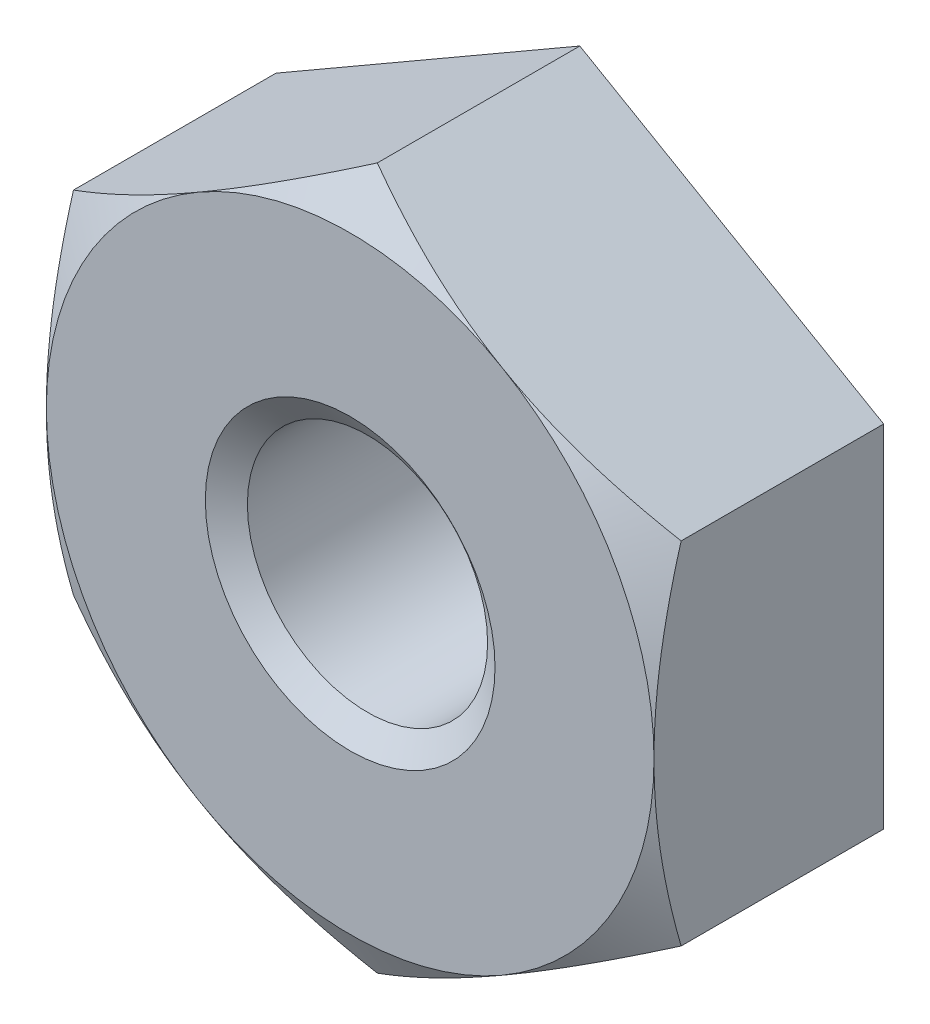
ISO-10303-21;
HEADER;
FILE_DESCRIPTION(('STEP AP214'),'2;1');
FILE_NAME('part.step','',(''),(''),'','','');
FILE_SCHEMA(('AUTOMOTIVE_DESIGN { 1 0 10303 214 1 1 1 1 }'));
ENDSEC;
DATA;
#1=APPLICATION_CONTEXT('core data for automotive mechanical design processes');
#2=APPLICATION_PROTOCOL_DEFINITION('international standard','automotive_design',2000,#1);
#3=PRODUCT_CONTEXT('',#1,'mechanical');
#4=PRODUCT('Part','Part','',(#3));
#5=PRODUCT_RELATED_PRODUCT_CATEGORY('part','',(#4));
#6=PRODUCT_DEFINITION_FORMATION('','',#4);
#7=PRODUCT_DEFINITION_CONTEXT('part definition',#1,'design');
#8=PRODUCT_DEFINITION('design','',#6,#7);
#9=PRODUCT_DEFINITION_SHAPE('','',#8);
#10=(LENGTH_UNIT() NAMED_UNIT(*) SI_UNIT(.MILLI.,.METRE.));
#11=(NAMED_UNIT(*) PLANE_ANGLE_UNIT() SI_UNIT($,.RADIAN.));
#12=(NAMED_UNIT(*) SI_UNIT($,.STERADIAN.) SOLID_ANGLE_UNIT());
#13=UNCERTAINTY_MEASURE_WITH_UNIT(LENGTH_MEASURE(1.E-05),#10,'distance_accuracy_value','');
#14=(GEOMETRIC_REPRESENTATION_CONTEXT(3) GLOBAL_UNCERTAINTY_ASSIGNED_CONTEXT((#13)) GLOBAL_UNIT_ASSIGNED_CONTEXT((#10,
#11,#12)) REPRESENTATION_CONTEXT('',''));
#15=CARTESIAN_POINT('',(0.,0.,0.));
#16=DIRECTION('',(0.,0.,1.));
#17=DIRECTION('',(1.,0.,0.));
#18=AXIS2_PLACEMENT_3D('',#15,#16,#17);
#19=CARTESIAN_POINT('',(0.,0.,-3.302));
#20=DIRECTION('',(0.,0.,1.));
#21=DIRECTION('',(1.,0.,0.));
#22=AXIS2_PLACEMENT_3D('',#19,#20,#21);
#23=CYLINDRICAL_SURFACE('',#22,1.7272);
#24=CARTESIAN_POINT('',(0.,0.,-0.248993800587372));
#25=DIRECTION('',(0.,0.,1.));
#26=DIRECTION('',(1.,0.,0.));
#27=AXIS2_PLACEMENT_3D('',#24,#25,#26);
#28=CIRCLE('',#27,1.7272);
#29=CARTESIAN_POINT('',(1.7272,0.,-0.248993800587372));
#30=VERTEX_POINT('',#29);
#31=EDGE_CURVE('E129',#30,#30,#28,.F.);
#32=CARTESIAN_POINT('',(0.,0.,-3.02760619941263));
#33=DIRECTION('',(0.,0.,-1.));
#34=DIRECTION('',(-1.,0.,0.));
#35=AXIS2_PLACEMENT_3D('',#32,#33,#34);
#36=CIRCLE('',#35,1.7272);
#37=CARTESIAN_POINT('',(1.7272,0.,-3.02760619941263));
#38=VERTEX_POINT('',#37);
#39=EDGE_CURVE('E35',#38,#38,#36,.F.);
#40=CARTESIAN_POINT('',(1.7272,0.,-0.248993800587372));
#41=CARTESIAN_POINT('',(1.7272,0.,-0.277937679741802));
#42=CARTESIAN_POINT('',(1.7272,0.,-0.306881558896231));
#43=CARTESIAN_POINT('',(1.7272,0.,-0.364769317205091));
#44=CARTESIAN_POINT('',(1.7272,0.,-0.39371319635952));
#45=CARTESIAN_POINT('',(1.7272,0.,-0.45160095466838));
#46=CARTESIAN_POINT('',(1.7272,0.,-0.48054483382281));
#47=CARTESIAN_POINT('',(1.7272,0.,-0.538432592131669));
#48=CARTESIAN_POINT('',(1.7272,0.,-0.567376471286099));
#49=CARTESIAN_POINT('',(1.7272,0.,-0.625264229594958));
#50=CARTESIAN_POINT('',(1.7272,0.,-0.654208108749388));
#51=CARTESIAN_POINT('',(1.7272,0.,-0.712095867058248));
#52=CARTESIAN_POINT('',(1.7272,0.,-0.741039746212677));
#53=CARTESIAN_POINT('',(1.7272,0.,-0.798927504521537));
#54=CARTESIAN_POINT('',(1.7272,0.,-0.827871383675967));
#55=CARTESIAN_POINT('',(1.7272,0.,-0.885759141984826));
#56=CARTESIAN_POINT('',(1.7272,0.,-0.914703021139256));
#57=CARTESIAN_POINT('',(1.7272,0.,-0.972590779448115));
#58=CARTESIAN_POINT('',(1.7272,0.,-1.00153465860254));
#59=CARTESIAN_POINT('',(1.7272,0.,-1.0594224169114));
#60=CARTESIAN_POINT('',(1.7272,0.,-1.08836629606583));
#61=CARTESIAN_POINT('',(1.7272,0.,-1.14625405437469));
#62=CARTESIAN_POINT('',(1.7272,0.,-1.17519793352912));
#63=CARTESIAN_POINT('',(1.7272,0.,-1.23308569183798));
#64=CARTESIAN_POINT('',(1.7272,0.,-1.26202957099241));
#65=CARTESIAN_POINT('',(1.7272,0.,-1.31991732930127));
#66=CARTESIAN_POINT('',(1.7272,0.,-1.3488612084557));
#67=CARTESIAN_POINT('',(1.7272,0.,-1.40674896676456));
#68=CARTESIAN_POINT('',(1.7272,0.,-1.43569284591899));
#69=CARTESIAN_POINT('',(1.7272,0.,-1.49358060422785));
#70=CARTESIAN_POINT('',(1.7272,0.,-1.52252448338228));
#71=CARTESIAN_POINT('',(1.7272,0.,-1.58041224169114));
#72=CARTESIAN_POINT('',(1.7272,0.,-1.60935612084557));
#73=CARTESIAN_POINT('',(1.7272,0.,-1.66724387915443));
#74=CARTESIAN_POINT('',(1.7272,0.,-1.69618775830886));
#75=CARTESIAN_POINT('',(1.7272,0.,-1.75407551661772));
#76=CARTESIAN_POINT('',(1.7272,0.,-1.78301939577215));
#77=CARTESIAN_POINT('',(1.7272,0.,-1.84090715408101));
#78=CARTESIAN_POINT('',(1.7272,0.,-1.86985103323544));
#79=CARTESIAN_POINT('',(1.7272,0.,-1.9277387915443));
#80=CARTESIAN_POINT('',(1.7272,0.,-1.95668267069873));
#81=CARTESIAN_POINT('',(1.7272,0.,-2.01457042900758));
#82=CARTESIAN_POINT('',(1.7272,0.,-2.04351430816201));
#83=CARTESIAN_POINT('',(1.7272,0.,-2.10140206647087));
#84=CARTESIAN_POINT('',(1.7272,0.,-2.1303459456253));
#85=CARTESIAN_POINT('',(1.7272,0.,-2.18823370393416));
#86=CARTESIAN_POINT('',(1.7272,0.,-2.21717758308859));
#87=CARTESIAN_POINT('',(1.7272,0.,-2.27506534139745));
#88=CARTESIAN_POINT('',(1.7272,0.,-2.30400922055188));
#89=CARTESIAN_POINT('',(1.7272,0.,-2.36189697886074));
#90=CARTESIAN_POINT('',(1.7272,0.,-2.39084085801517));
#91=CARTESIAN_POINT('',(1.7272,0.,-2.44872861632403));
#92=CARTESIAN_POINT('',(1.7272,0.,-2.47767249547846));
#93=CARTESIAN_POINT('',(1.7272,0.,-2.53556025378732));
#94=CARTESIAN_POINT('',(1.7272,0.,-2.56450413294175));
#95=CARTESIAN_POINT('',(1.7272,0.,-2.62239189125061));
#96=CARTESIAN_POINT('',(1.7272,0.,-2.65133577040504));
#97=CARTESIAN_POINT('',(1.7272,0.,-2.7092235287139));
#98=CARTESIAN_POINT('',(1.7272,0.,-2.73816740786833));
#99=CARTESIAN_POINT('',(1.7272,0.,-2.79605516617719));
#100=CARTESIAN_POINT('',(1.7272,0.,-2.82499904533162));
#101=CARTESIAN_POINT('',(1.7272,0.,-2.88288680364048));
#102=CARTESIAN_POINT('',(1.7272,0.,-2.91183068279491));
#103=CARTESIAN_POINT('',(1.7272,0.,-2.96971844110377));
#104=CARTESIAN_POINT('',(1.7272,0.,-2.9986623202582));
#105=CARTESIAN_POINT('',(1.7272,0.,-3.02760619941263));
#106=B_SPLINE_CURVE_WITH_KNOTS('',3,(#40,#41,#42,#43,#44,#45,#46,#47,#48,#49,#50,#51,#52,#53,
#54,#55,#56,#57,#58,#59,#60,#61,#62,#63,#64,#65,#66,#67,#68,#69,#70,#71,#72,#73,#74,#75,#76,#77,
#78,#79,#80,#81,#82,#83,#84,#85,#86,#87,#88,#89,#90,#91,#92,#93,#94,#95,#96,#97,#98,#99,#100,
#101,#102,#103,#104,#105),.UNSPECIFIED.,.F.,.F.,(4,2,2,2,2,2,2,2,2,2,2,2,2,2,2,2,2,2,2,2,2,2,2,
2,2,2,2,2,2,2,2,2,4),(0.,0.0868316374632891,0.173663274926578,0.260494912389868,
0.347326549853157,0.434158187316446,0.520989824779735,0.607821462243024,0.694653099706314,
0.781484737169603,0.868316374632892,0.955148012096181,1.04197964955947,1.12881128702276,
1.21564292448605,1.30247456194934,1.38930619941263,1.47613783687592,1.56296947433921,
1.64980111180249,1.73663274926578,1.82346438672907,1.91029602419236,1.99712766165565,
2.08395929911894,2.17079093658223,2.25762257404552,2.34445421150881,2.4312858489721,
2.51811748643539,2.60494912389868,2.69178076136196,2.77861239882525),.UNSPECIFIED.);
#107=EDGE_CURVE('BSEAM30',#30,#38,#106,.T.);
#108=ORIENTED_EDGE('',*,*,#31,.F.);
#109=ORIENTED_EDGE('',*,*,#39,.F.);
#110=ORIENTED_EDGE('',*,*,#107,.T.);
#111=ORIENTED_EDGE('',*,*,#107,.F.);
#112=EDGE_LOOP('',(#108,#110,#109,#111));
#113=FACE_BOUND('',#112,.T.);
#114=ADVANCED_FACE('F30',(#113),#23,.F.);
#115=CARTESIAN_POINT('',(-8.73759999999999,0.,-3.302));
#116=DIRECTION('',(0.,0.,1.));
#117=DIRECTION('',(1.,0.,0.));
#118=AXIS2_PLACEMENT_3D('',#115,#116,#117);
#119=PLANE('',#118);
#120=DIRECTION('',(-0.866025403784438,-0.500000000000001,0.));
#121=VECTOR('',#120,1.);
#122=CARTESIAN_POINT('',(0.,5.04465571207128,-3.302));
#123=LINE('',#122,#121);
#124=CARTESIAN_POINT('',(0.,5.04465571207128,-3.302));
#125=VERTEX_POINT('',#124);
#126=CARTESIAN_POINT('',(-4.3688,2.52232785603563,-3.302));
#127=VERTEX_POINT('',#126);
#128=EDGE_CURVE('E252',#125,#127,#123,.T.);
#129=ORIENTED_EDGE('',*,*,#128,.F.);
#130=DIRECTION('',(-0.866025403784438,0.500000000000001,0.));
#131=VECTOR('',#130,1.);
#132=CARTESIAN_POINT('',(4.3688,2.52232785603564,-3.302));
#133=LINE('',#132,#131);
#134=CARTESIAN_POINT('',(4.3688,2.52232785603564,-3.302));
#135=VERTEX_POINT('',#134);
#136=EDGE_CURVE('E228',#135,#125,#133,.T.);
#137=ORIENTED_EDGE('',*,*,#136,.F.);
#138=DIRECTION('',(0.,-1.,0.));
#139=VECTOR('',#138,1.);
#140=CARTESIAN_POINT('',(4.3688,2.52232785603564,-3.302));
#141=LINE('',#140,#139);
#142=CARTESIAN_POINT('',(4.3688,-2.52232785603564,-3.302));
#143=VERTEX_POINT('',#142);
#144=EDGE_CURVE('E241',#135,#143,#141,.T.);
#145=ORIENTED_EDGE('',*,*,#144,.T.);
#146=DIRECTION('',(0.866025403784438,0.500000000000001,0.));
#147=VECTOR('',#146,1.);
#148=CARTESIAN_POINT('',(0.,-5.04465571207129,-3.302));
#149=LINE('',#148,#147);
#150=CARTESIAN_POINT('',(0.,-5.04465571207129,-3.302));
#151=VERTEX_POINT('',#150);
#152=EDGE_CURVE('E243',#151,#143,#149,.T.);
#153=ORIENTED_EDGE('',*,*,#152,.F.);
#154=DIRECTION('',(0.866025403784438,-0.500000000000001,0.));
#155=VECTOR('',#154,1.);
#156=CARTESIAN_POINT('',(-4.3688,-2.52232785603564,-3.302));
#157=LINE('',#156,#155);
#158=CARTESIAN_POINT('',(-4.3688,-2.52232785603564,-3.302));
#159=VERTEX_POINT('',#158);
#160=EDGE_CURVE('E246',#159,#151,#157,.T.);
#161=ORIENTED_EDGE('',*,*,#160,.F.);
#162=DIRECTION('',(0.,-1.,0.));
#163=VECTOR('',#162,1.);
#164=CARTESIAN_POINT('',(-4.3688,2.52232785603563,-3.302));
#165=LINE('',#164,#163);
#166=EDGE_CURVE('E249',#127,#159,#165,.T.);
#167=ORIENTED_EDGE('',*,*,#166,.F.);
#168=EDGE_LOOP('',(#129,#137,#145,#153,#161,#167));
#169=FACE_BOUND('',#168,.T.);
#170=CARTESIAN_POINT('',(0.,0.,-3.302));
#171=DIRECTION('',(0.,0.,1.));
#172=DIRECTION('',(1.,0.,0.));
#173=AXIS2_PLACEMENT_3D('',#170,#171,#172);
#174=CIRCLE('',#173,2.0828);
#175=CARTESIAN_POINT('',(2.0828,0.,-3.302));
#176=VERTEX_POINT('',#175);
#177=EDGE_CURVE('E213',#176,#176,#174,.F.);
#178=ORIENTED_EDGE('',*,*,#177,.F.);
#179=EDGE_LOOP('',(#178));
#180=FACE_BOUND('',#179,.T.);
#181=ADVANCED_FACE('F200',(#169,#180),#119,.F.);
#182=CARTESIAN_POINT('',(-8.73759999999999,0.,0.));
#183=DIRECTION('',(0.,0.,1.));
#184=DIRECTION('',(1.,0.,0.));
#185=AXIS2_PLACEMENT_3D('',#182,#183,#184);
#186=PLANE('',#185);
#187=CARTESIAN_POINT('',(0.,0.,0.));
#188=DIRECTION('',(0.,0.,1.));
#189=DIRECTION('',(1.,0.,0.));
#190=AXIS2_PLACEMENT_3D('',#187,#188,#189);
#191=CIRCLE('',#190,4.3688);
#192=CARTESIAN_POINT('',(4.3688,0.,0.));
#193=VERTEX_POINT('',#192);
#194=CARTESIAN_POINT('',(2.18440000000001,-3.78349178405345,0.));
#195=VERTEX_POINT('',#194);
#196=EDGE_CURVE('E11',#193,#195,#191,.F.);
#197=ORIENTED_EDGE('',*,*,#196,.F.);
#198=CARTESIAN_POINT('',(0.,0.,0.));
#199=DIRECTION('',(0.,0.,1.));
#200=DIRECTION('',(1.,0.,0.));
#201=AXIS2_PLACEMENT_3D('',#198,#199,#200);
#202=CIRCLE('',#201,4.3688);
#203=CARTESIAN_POINT('',(2.1844,3.78349178405345,0.));
#204=VERTEX_POINT('',#203);
#205=EDGE_CURVE('E121',#193,#204,#202,.T.);
#206=ORIENTED_EDGE('',*,*,#205,.T.);
#207=CARTESIAN_POINT('',(-2.18440000000001,3.78349178405345,0.));
#208=VERTEX_POINT('',#207);
#209=EDGE_CURVE('E42',#208,#204,#191,.F.);
#210=ORIENTED_EDGE('',*,*,#209,.F.);
#211=CARTESIAN_POINT('',(-4.3688,0.,0.));
#212=VERTEX_POINT('',#211);
#213=EDGE_CURVE('E281',#212,#208,#191,.F.);
#214=ORIENTED_EDGE('',*,*,#213,.F.);
#215=CARTESIAN_POINT('',(-2.1844,-3.78349178405345,0.));
#216=VERTEX_POINT('',#215);
#217=EDGE_CURVE('E279',#216,#212,#191,.F.);
#218=ORIENTED_EDGE('',*,*,#217,.F.);
#219=EDGE_CURVE('E40',#195,#216,#191,.F.);
#220=ORIENTED_EDGE('',*,*,#219,.F.);
#221=EDGE_LOOP('',(#197,#206,#210,#214,#218,#220));
#222=FACE_BOUND('',#221,.T.);
#223=CARTESIAN_POINT('',(0.,0.,0.));
#224=DIRECTION('',(0.,0.,1.));
#225=DIRECTION('',(1.,0.,0.));
#226=AXIS2_PLACEMENT_3D('',#223,#224,#225);
#227=CIRCLE('',#226,2.0828);
#228=CARTESIAN_POINT('',(2.0828,0.,0.));
#229=VERTEX_POINT('',#228);
#230=EDGE_CURVE('E212',#229,#229,#227,.T.);
#231=ORIENTED_EDGE('',*,*,#230,.F.);
#232=EDGE_LOOP('',(#231));
#233=FACE_BOUND('',#232,.T.);
#234=ADVANCED_FACE('F131',(#222,#233),#186,.T.);
#235=CARTESIAN_POINT('',(0.,5.04465571207128,-3.302));
#236=DIRECTION('',(-0.500000000000001,0.866025403784438,0.));
#237=DIRECTION('',(-0.866025403784438,-0.500000000000001,0.));
#238=AXIS2_PLACEMENT_3D('',#235,#236,#237);
#239=PLANE('',#238);
#240=DIRECTION('',(0.,0.,1.));
#241=VECTOR('',#240,1.);
#242=CARTESIAN_POINT('',(-4.3688,2.52232785603563,-3.302));
#243=LINE('',#242,#241);
#244=CARTESIAN_POINT('',(-4.3688,2.52232785603563,-0.3902054772977));
#245=VERTEX_POINT('',#244);
#246=EDGE_CURVE('E224',#127,#245,#243,.T.);
#247=ORIENTED_EDGE('',*,*,#246,.T.);
#248=CARTESIAN_POINT('',(-4.369,2.52221238598179,-0.390272146253268));
#249=CARTESIAN_POINT('',(-4.17701432322195,2.63305536815015,-0.326254019345325));
#250=CARTESIAN_POINT('',(-3.98337143625713,2.74485514106595,-0.268032047091907));
#251=CARTESIAN_POINT('',(-3.59273259013828,2.97039058402859,-0.166405423750635));
#252=CARTESIAN_POINT('',(-3.39572969030934,3.08413026127597,-0.123036723706271));
#253=CARTESIAN_POINT('',(-3.00416535018124,3.31020003845398,-0.0555275892763381));
#254=CARTESIAN_POINT('',(-2.8096641539418,3.42249535646053,-0.0309378363235533));
#255=CARTESIAN_POINT('',(-2.41974664983152,3.64761433242035,-0.00158375292557013));
#256=CARTESIAN_POINT('',(-2.22433175903685,3.76043717222432,0.00320488626191379));
#257=CARTESIAN_POINT('',(-1.85919363799043,3.97124976470186,-0.00676154410745537));
#258=CARTESIAN_POINT('',(-1.6894157250961,4.06927108841386,-0.0190695182980131));
#259=CARTESIAN_POINT('',(-1.35096599187974,4.26467513299348,-0.0580772044287665));
#260=CARTESIAN_POINT('',(-1.18229534203414,4.36205717808622,-0.0847902391814816));
#261=CARTESIAN_POINT('',(-0.843147890127902,4.55786405073927,-0.151570221556089));
#262=CARTESIAN_POINT('',(-0.67271400871229,4.6562640980536,-0.191920224220218));
#263=CARTESIAN_POINT('',(-0.334388108152011,4.8515966478159,-0.283498656513236));
#264=CARTESIAN_POINT('',(-0.166491755144837,4.94853165242055,-0.33470557081654));
#265=CARTESIAN_POINT('',(0.000199999999998779,5.04477118212511,-0.390272146253271));
#266=B_SPLINE_CURVE_WITH_KNOTS('',3,(#248,#249,#250,#251,#252,#253,#254,#255,#256,#257,#258,
#259,#260,#261,#262,#263,#264,#265),.UNSPECIFIED.,.F.,.F.,(4,2,2,2,2,2,2,2,4),(0.,
0.692505588180071,1.38667567200999,2.06366565456448,2.73982428641929,3.32854996891366,
3.91782108250885,4.5201625585125,5.12132133857944),.UNSPECIFIED.);
#267=EDGE_CURVE('E115',#245,#208,#266,.T.);
#268=ORIENTED_EDGE('',*,*,#267,.T.);
#269=CARTESIAN_POINT('',(0.,5.04465571207128,-0.390205477297699));
#270=VERTEX_POINT('',#269);
#271=EDGE_CURVE('E142',#208,#270,#266,.T.);
#272=ORIENTED_EDGE('',*,*,#271,.T.);
#273=DIRECTION('',(0.,0.,1.));
#274=VECTOR('',#273,1.);
#275=CARTESIAN_POINT('',(0.,5.04465571207128,-3.302));
#276=LINE('',#275,#274);
#277=EDGE_CURVE('E236',#125,#270,#276,.T.);
#278=ORIENTED_EDGE('',*,*,#277,.F.);
#279=ORIENTED_EDGE('',*,*,#128,.T.);
#280=EDGE_LOOP('',(#247,#268,#272,#278,#279));
#281=FACE_BOUND('',#280,.T.);
#282=ADVANCED_FACE('F32',(#281),#239,.T.);
#283=CARTESIAN_POINT('',(4.3688,2.52232785603564,-3.302));
#284=DIRECTION('',(0.5,0.866025403784438,0.));
#285=DIRECTION('',(-0.866025403784438,0.500000000000001,0.));
#286=AXIS2_PLACEMENT_3D('',#283,#284,#285);
#287=PLANE('',#286);
#288=ORIENTED_EDGE('',*,*,#277,.T.);
#289=CARTESIAN_POINT('',(-0.000200000000001958,5.04477118212511,-0.390272146253271));
#290=CARTESIAN_POINT('',(0.191785676778043,4.93392819995676,-0.326254019345328));
#291=CARTESIAN_POINT('',(0.385428563742871,4.82212842704096,-0.268032047091909));
#292=CARTESIAN_POINT('',(0.776067409861722,4.59659298407831,-0.166405423750637));
#293=CARTESIAN_POINT('',(0.973070309690658,4.48285330683094,-0.123036723706273));
#294=CARTESIAN_POINT('',(1.36463464981876,4.25678352965292,-0.055527589276339));
#295=CARTESIAN_POINT('',(1.55913584605819,4.14448821164638,-0.0309378363235539));
#296=CARTESIAN_POINT('',(1.94905335016848,3.91936923568656,-0.00158375292557032));
#297=CARTESIAN_POINT('',(2.14446824096316,3.80654639588259,0.00320488626191369));
#298=CARTESIAN_POINT('',(2.50960636200957,3.59573380340505,-0.00676154410745529));
#299=CARTESIAN_POINT('',(2.67938427490391,3.49771247969305,-0.019069518298013));
#300=CARTESIAN_POINT('',(3.01783400812026,3.30230843511343,-0.058077204428766));
#301=CARTESIAN_POINT('',(3.18650465796586,3.20492639002069,-0.0847902391814807));
#302=CARTESIAN_POINT('',(3.5256521098721,3.00911951736764,-0.151570221556088));
#303=CARTESIAN_POINT('',(3.69608599128771,2.91071947005331,-0.191920224220216));
#304=CARTESIAN_POINT('',(4.03441189184799,2.71538692029101,-0.283498656513234));
#305=CARTESIAN_POINT('',(4.20230824485516,2.61845191568636,-0.334705570816538));
#306=CARTESIAN_POINT('',(4.369,2.5222123859818,-0.390272146253269));
#307=B_SPLINE_CURVE_WITH_KNOTS('',3,(#289,#290,#291,#292,#293,#294,#295,#296,#297,#298,#299,
#300,#301,#302,#303,#304,#305,#306),.UNSPECIFIED.,.F.,.F.,(4,2,2,2,2,2,2,2,4),(0.,
0.692505588180072,1.38667567200999,2.06366565456448,2.73982428641929,3.32854996891367,
3.91782108250886,4.5201625585125,5.12132133857944),.UNSPECIFIED.);
#308=EDGE_CURVE('E138',#270,#204,#307,.T.);
#309=ORIENTED_EDGE('',*,*,#308,.T.);
#310=CARTESIAN_POINT('',(4.3688,2.52232785603564,-0.390205477297699));
#311=VERTEX_POINT('',#310);
#312=EDGE_CURVE('E124',#204,#311,#307,.T.);
#313=ORIENTED_EDGE('',*,*,#312,.T.);
#314=DIRECTION('',(0.,0.,1.));
#315=VECTOR('',#314,1.);
#316=CARTESIAN_POINT('',(4.3688,2.52232785603564,-3.302));
#317=LINE('',#316,#315);
#318=EDGE_CURVE('E137',#135,#311,#317,.T.);
#319=ORIENTED_EDGE('',*,*,#318,.F.);
#320=ORIENTED_EDGE('',*,*,#136,.T.);
#321=EDGE_LOOP('',(#288,#309,#313,#319,#320));
#322=FACE_BOUND('',#321,.T.);
#323=ADVANCED_FACE('F257',(#322),#287,.T.);
#324=CARTESIAN_POINT('',(4.3688,2.52232785603564,-3.302));
#325=DIRECTION('',(-1.,0.,0.));
#326=DIRECTION('',(0.,0.,1.));
#327=AXIS2_PLACEMENT_3D('',#324,#325,#326);
#328=PLANE('',#327);
#329=CARTESIAN_POINT('',(4.3688,-6.68958518743313,-2.09058747015903));
#330=CARTESIAN_POINT('',(4.3688,-6.49777016317985,-1.99789185471359));
#331=CARTESIAN_POINT('',(4.3688,-6.30550162360646,-1.90611771072942));
#332=CARTESIAN_POINT('',(4.3688,-5.919812301523,-1.7249389254409));
#333=CARTESIAN_POINT('',(4.3688,-5.72639132652265,-1.63553469438958));
#334=CARTESIAN_POINT('',(4.3688,-5.33710707680669,-1.45915130833322));
#335=CARTESIAN_POINT('',(4.3688,-5.14123615996685,-1.37218895887827));
#336=CARTESIAN_POINT('',(4.3688,-4.74788442913253,-1.20199950616559));
#337=CARTESIAN_POINT('',(4.3688,-4.55040369969016,-1.11877220820663));
#338=CARTESIAN_POINT('',(4.3688,-4.15106673826398,-0.956057977466858));
#339=CARTESIAN_POINT('',(4.3688,-3.94918655341588,-0.876629508962582));
#340=CARTESIAN_POINT('',(4.3688,-3.54304484348439,-0.723993430313052));
#341=CARTESIAN_POINT('',(4.3688,-3.338783056327,-0.65078651228273));
#342=CARTESIAN_POINT('',(4.3688,-2.92797339248016,-0.512560407179517));
#343=CARTESIAN_POINT('',(4.3688,-2.72143143217471,-0.447523813031698));
#344=CARTESIAN_POINT('',(4.3688,-2.30540922017469,-0.327751192809323));
#345=CARTESIAN_POINT('',(4.3688,-2.09592992027346,-0.27301190932798));
#346=CARTESIAN_POINT('',(4.3688,-1.67389951675793,-0.176488903460131));
#347=CARTESIAN_POINT('',(4.3688,-1.46134761097217,-0.13470863065931));
#348=CARTESIAN_POINT('',(4.3688,-1.03365293078833,-0.0669258210586632));
#349=CARTESIAN_POINT('',(4.3688,-0.818510154099769,-0.0409232982083516));
#350=CARTESIAN_POINT('',(4.3688,-0.495449298048832,-0.0154234920898188));
#351=CARTESIAN_POINT('',(4.3688,-0.38803908099844,-0.00917291776942587));
#352=CARTESIAN_POINT('',(4.3688,-0.173053157711787,-0.00121763636852822));
#353=CARTESIAN_POINT('',(4.3688,-0.0654774536427616,0.000487129745749073));
#354=CARTESIAN_POINT('',(4.3688,0.257152191545762,-0.00132501851328305));
#355=CARTESIAN_POINT('',(4.3688,0.472211053929907,-0.0117601656507523));
#356=CARTESIAN_POINT('',(4.3688,0.839428709857252,-0.0446463142807151));
#357=CARTESIAN_POINT('',(4.3688,0.992000760315655,-0.062811656846004));
#358=CARTESIAN_POINT('',(4.3688,1.29596699062512,-0.10726976718274));
#359=CARTESIAN_POINT('',(4.3688,1.44736101064885,-0.133563618724753));
#360=CARTESIAN_POINT('',(4.3688,1.89965396000277,-0.223261837826227));
#361=CARTESIAN_POINT('',(4.3688,2.19843156204362,-0.297459397479416));
#362=CARTESIAN_POINT('',(4.3688,2.64550767125623,-0.425429796477862));
#363=CARTESIAN_POINT('',(4.3688,2.79613613241495,-0.471517975005144));
#364=CARTESIAN_POINT('',(4.3688,3.09582081741505,-0.568254810771603));
#365=CARTESIAN_POINT('',(4.3688,3.24487804754844,-0.618900322497454));
#366=CARTESIAN_POINT('',(4.3688,3.54079706259956,-0.723697946842163));
#367=CARTESIAN_POINT('',(4.3688,3.68766648253473,-0.777828717406924));
#368=CARTESIAN_POINT('',(4.3688,3.98026581207414,-0.889267440910809));
#369=CARTESIAN_POINT('',(4.3688,4.12599523358397,-0.946576677958952));
#370=CARTESIAN_POINT('',(4.3688,4.27119772033257,-1.00516149694495));
#371=B_SPLINE_CURVE_WITH_KNOTS('',3,(#329,#330,#331,#332,#333,#334,#335,#336,#337,#338,#339,
#340,#341,#342,#343,#344,#345,#346,#347,#348,#349,#350,#351,#352,#353,#354,#355,#356,#357,#358,
#359,#360,#361,#362,#363,#364,#365,#366,#367,#368,#369,#370),.UNSPECIFIED.,.F.,.F.,(4,2,2,2,2,2,
2,2,2,2,2,2,2,2,2,2,2,2,2,2,4),(0.,0.639124631803745,1.27835918866052,1.9212518267235,
2.56411091297887,3.21486231369451,3.86568601259514,4.51509871222719,5.16430563271765,
5.813685218915,6.4630653792447,6.78575484429632,7.10844011874675,7.75350352855424,
8.21423767153292,8.67503327050771,9.59732151021674,10.0698486304712,10.5420520737689,
11.0115976388432,11.4813343033428),.UNSPECIFIED.);
#372=CARTESIAN_POINT('',(4.3688,-2.52232785603564,-0.390205477297699));
#373=VERTEX_POINT('',#372);
#374=EDGE_CURVE('E104',#373,#193,#371,.T.);
#375=ORIENTED_EDGE('',*,*,#374,.F.);
#376=DIRECTION('',(0.,0.,1.));
#377=VECTOR('',#376,1.);
#378=CARTESIAN_POINT('',(4.3688,-2.52232785603564,-3.302));
#379=LINE('',#378,#377);
#380=EDGE_CURVE('E233',#143,#373,#379,.T.);
#381=ORIENTED_EDGE('',*,*,#380,.F.);
#382=ORIENTED_EDGE('',*,*,#144,.F.);
#383=ORIENTED_EDGE('',*,*,#318,.T.);
#384=EDGE_CURVE('E117',#193,#311,#371,.T.);
#385=ORIENTED_EDGE('',*,*,#384,.F.);
#386=EDGE_LOOP('',(#375,#381,#382,#383,#385));
#387=FACE_BOUND('',#386,.T.);
#388=ADVANCED_FACE('F135',(#387),#328,.F.);
#389=CARTESIAN_POINT('',(0.,-5.04465571207129,-3.302));
#390=DIRECTION('',(0.500000000000001,-0.866025403784438,0.));
#391=DIRECTION('',(0.866025403784438,0.500000000000001,0.));
#392=AXIS2_PLACEMENT_3D('',#389,#390,#391);
#393=PLANE('',#392);
#394=ORIENTED_EDGE('',*,*,#380,.T.);
#395=CARTESIAN_POINT('',(4.369,-2.5222123859818,-0.390272146253271));
#396=CARTESIAN_POINT('',(4.17701432322195,-2.63305536815016,-0.326254019345329));
#397=CARTESIAN_POINT('',(3.98337143625713,-2.74485514106596,-0.26803204709191));
#398=CARTESIAN_POINT('',(3.59273259013828,-2.97039058402861,-0.166405423750638));
#399=CARTESIAN_POINT('',(3.39572969030934,-3.08413026127598,-0.123036723706274));
#400=CARTESIAN_POINT('',(3.00416535018124,-3.310200038454,-0.0555275892763415));
#401=CARTESIAN_POINT('',(2.8096641539418,-3.42249535646054,-0.0309378363235572));
#402=CARTESIAN_POINT('',(2.41974664983151,-3.64761433242036,-0.00158375292557479));
#403=CARTESIAN_POINT('',(2.22433175903684,-3.76043717222433,0.0032048862619088));
#404=CARTESIAN_POINT('',(1.85919363799043,-3.97124976470187,-0.00676154410746063));
#405=CARTESIAN_POINT('',(1.68941572509609,-4.06927108841387,-0.0190695182980184));
#406=CARTESIAN_POINT('',(1.35096599187974,-4.26467513299349,-0.0580772044287723));
#407=CARTESIAN_POINT('',(1.18229534203414,-4.36205717808624,-0.0847902391814878));
#408=CARTESIAN_POINT('',(0.8431478901279,-4.55786405073928,-0.151570221556096));
#409=CARTESIAN_POINT('',(0.672714008712288,-4.65626409805362,-0.191920224220224));
#410=CARTESIAN_POINT('',(0.334388108152009,-4.85159664781592,-0.283498656513241));
#411=CARTESIAN_POINT('',(0.166491755144836,-4.94853165242056,-0.334705570816546));
#412=CARTESIAN_POINT('',(-0.000199999999999165,-5.04477118212513,-0.390272146253277));
#413=B_SPLINE_CURVE_WITH_KNOTS('',3,(#395,#396,#397,#398,#399,#400,#401,#402,#403,#404,#405,
#406,#407,#408,#409,#410,#411,#412),.UNSPECIFIED.,.F.,.F.,(4,2,2,2,2,2,2,2,4),(0.,
0.692505588180072,1.38667567200999,2.06366565456448,2.73982428641929,3.32854996891367,
3.91782108250885,4.5201625585125,5.12132133857944),.UNSPECIFIED.);
#414=EDGE_CURVE('E110',#373,#195,#413,.T.);
#415=ORIENTED_EDGE('',*,*,#414,.T.);
#416=CARTESIAN_POINT('',(0.,-5.04465571207128,-0.390205477297699));
#417=VERTEX_POINT('',#416);
#418=EDGE_CURVE('E49',#195,#417,#413,.T.);
#419=ORIENTED_EDGE('',*,*,#418,.T.);
#420=DIRECTION('',(0.,0.,1.));
#421=VECTOR('',#420,1.);
#422=CARTESIAN_POINT('',(0.,-5.04465571207129,-3.302));
#423=LINE('',#422,#421);
#424=EDGE_CURVE('E230',#151,#417,#423,.T.);
#425=ORIENTED_EDGE('',*,*,#424,.F.);
#426=ORIENTED_EDGE('',*,*,#152,.T.);
#427=EDGE_LOOP('',(#394,#415,#419,#425,#426));
#428=FACE_BOUND('',#427,.T.);
#429=ADVANCED_FACE('F189',(#428),#393,.T.);
#430=CARTESIAN_POINT('',(-4.3688,-2.52232785603564,-3.302));
#431=DIRECTION('',(-0.500000000000001,-0.866025403784438,0.));
#432=DIRECTION('',(0.866025403784438,-0.500000000000001,0.));
#433=AXIS2_PLACEMENT_3D('',#430,#431,#432);
#434=PLANE('',#433);
#435=ORIENTED_EDGE('',*,*,#424,.T.);
#436=CARTESIAN_POINT('',(0.000200000000000651,-5.04477118212513,-0.390272146253277));
#437=CARTESIAN_POINT('',(-0.191785676778045,-4.93392819995677,-0.326254019345334));
#438=CARTESIAN_POINT('',(-0.385428563742873,-4.82212842704097,-0.268032047091915));
#439=CARTESIAN_POINT('',(-0.776067409861725,-4.59659298407832,-0.166405423750643));
#440=CARTESIAN_POINT('',(-0.973070309690662,-4.48285330683095,-0.123036723706279));
#441=CARTESIAN_POINT('',(-1.36463464981876,-4.25678352965293,-0.0555275892763448));
#442=CARTESIAN_POINT('',(-1.5591358460582,-4.14448821164639,-0.0309378363235597));
#443=CARTESIAN_POINT('',(-1.94905335016849,-3.91936923568657,-0.00158375292557577));
#444=CARTESIAN_POINT('',(-2.14446824096316,-3.8065463958826,0.00320488626190853));
#445=CARTESIAN_POINT('',(-2.50960636200958,-3.59573380340506,-0.00676154410746014));
#446=CARTESIAN_POINT('',(-2.67938427490391,-3.49771247969306,-0.0190695182980177));
#447=CARTESIAN_POINT('',(-3.01783400812027,-3.30230843511344,-0.0580772044287706));
#448=CARTESIAN_POINT('',(-3.18650465796587,-3.20492639002069,-0.0847902391814854));
#449=CARTESIAN_POINT('',(-3.5256521098721,-3.00911951736765,-0.151570221556092));
#450=CARTESIAN_POINT('',(-3.69608599128771,-2.91071947005332,-0.19192022422022));
#451=CARTESIAN_POINT('',(-4.03441189184799,-2.71538692029102,-0.283498656513237));
#452=CARTESIAN_POINT('',(-4.20230824485516,-2.61845191568637,-0.334705570816541));
#453=CARTESIAN_POINT('',(-4.369,-2.52221238598181,-0.390272146253272));
#454=B_SPLINE_CURVE_WITH_KNOTS('',3,(#436,#437,#438,#439,#440,#441,#442,#443,#444,#445,#446,
#447,#448,#449,#450,#451,#452,#453),.UNSPECIFIED.,.F.,.F.,(4,2,2,2,2,2,2,2,4),(0.,
0.692505588180074,1.38667567200999,2.06366565456448,2.73982428641929,3.32854996891367,
3.91782108250886,4.5201625585125,5.12132133857944),.UNSPECIFIED.);
#455=EDGE_CURVE('E183',#417,#216,#454,.T.);
#456=ORIENTED_EDGE('',*,*,#455,.T.);
#457=CARTESIAN_POINT('',(-4.3688,-2.52232785603564,-0.390205477297699));
#458=VERTEX_POINT('',#457);
#459=EDGE_CURVE('E56',#216,#458,#454,.T.);
#460=ORIENTED_EDGE('',*,*,#459,.T.);
#461=DIRECTION('',(0.,0.,1.));
#462=VECTOR('',#461,1.);
#463=CARTESIAN_POINT('',(-4.3688,-2.52232785603564,-3.302));
#464=LINE('',#463,#462);
#465=EDGE_CURVE('E227',#159,#458,#464,.T.);
#466=ORIENTED_EDGE('',*,*,#465,.F.);
#467=ORIENTED_EDGE('',*,*,#160,.T.);
#468=EDGE_LOOP('',(#435,#456,#460,#466,#467));
#469=FACE_BOUND('',#468,.T.);
#470=ADVANCED_FACE('F185',(#469),#434,.T.);
#471=CARTESIAN_POINT('',(-4.3688,2.52232785603563,-3.302));
#472=DIRECTION('',(-1.,0.,0.));
#473=DIRECTION('',(0.,0.,1.));
#474=AXIS2_PLACEMENT_3D('',#471,#472,#473);
#475=PLANE('',#474);
#476=ORIENTED_EDGE('',*,*,#465,.T.);
#477=CARTESIAN_POINT('',(-4.3688,-6.68958518743314,-2.09058747015903));
#478=CARTESIAN_POINT('',(-4.3688,-6.49777016317985,-1.99789185471359));
#479=CARTESIAN_POINT('',(-4.3688,-6.30550162360647,-1.90611771072943));
#480=CARTESIAN_POINT('',(-4.3688,-5.919812301523,-1.7249389254409));
#481=CARTESIAN_POINT('',(-4.3688,-5.72639132652265,-1.63553469438959));
#482=CARTESIAN_POINT('',(-4.3688,-5.33710707680669,-1.45915130833322));
#483=CARTESIAN_POINT('',(-4.3688,-5.14123615996685,-1.37218895887827));
#484=CARTESIAN_POINT('',(-4.3688,-4.74788442913253,-1.20199950616559));
#485=CARTESIAN_POINT('',(-4.3688,-4.55040369969016,-1.11877220820663));
#486=CARTESIAN_POINT('',(-4.3688,-4.15106673826398,-0.956057977466859));
#487=CARTESIAN_POINT('',(-4.3688,-3.94918655341589,-0.876629508962583));
#488=CARTESIAN_POINT('',(-4.3688,-3.54304484348439,-0.723993430313053));
#489=CARTESIAN_POINT('',(-4.3688,-3.338783056327,-0.650786512282731));
#490=CARTESIAN_POINT('',(-4.3688,-2.92797339248016,-0.512560407179518));
#491=CARTESIAN_POINT('',(-4.3688,-2.72143143217471,-0.447523813031699));
#492=CARTESIAN_POINT('',(-4.3688,-2.3054092201747,-0.327751192809324));
#493=CARTESIAN_POINT('',(-4.3688,-2.09592992027346,-0.273011909327981));
#494=CARTESIAN_POINT('',(-4.3688,-1.67389951675794,-0.176488903460131));
#495=CARTESIAN_POINT('',(-4.3688,-1.46134761097217,-0.13470863065931));
#496=CARTESIAN_POINT('',(-4.3688,-1.03365293078833,-0.0669258210586638));
#497=CARTESIAN_POINT('',(-4.3688,-0.818510154099772,-0.0409232982083524));
#498=CARTESIAN_POINT('',(-4.3688,-0.495449298048834,-0.0154234920898191));
#499=CARTESIAN_POINT('',(-4.3688,-0.388039080998443,-0.00917291776942595));
#500=CARTESIAN_POINT('',(-4.3688,-0.173053157711789,-0.00121763636852814));
#501=CARTESIAN_POINT('',(-4.3688,-0.0654774536427639,0.00048712974574906));
#502=CARTESIAN_POINT('',(-4.3688,0.25715219154576,-0.00132501851328302));
#503=CARTESIAN_POINT('',(-4.3688,0.472211053929905,-0.0117601656507518));
#504=CARTESIAN_POINT('',(-4.3688,0.83942870985725,-0.0446463142807147));
#505=CARTESIAN_POINT('',(-4.3688,0.992000760315653,-0.0628116568460038));
#506=CARTESIAN_POINT('',(-4.3688,1.29596699062512,-0.10726976718274));
#507=CARTESIAN_POINT('',(-4.3688,1.44736101064885,-0.133563618724753));
#508=CARTESIAN_POINT('',(-4.3688,1.89965396000277,-0.223261837826226));
#509=CARTESIAN_POINT('',(-4.3688,2.19843156204361,-0.297459397479415));
#510=CARTESIAN_POINT('',(-4.3688,2.64550767125622,-0.425429796477861));
#511=CARTESIAN_POINT('',(-4.3688,2.79613613241494,-0.471517975005143));
#512=CARTESIAN_POINT('',(-4.3688,3.09582081741505,-0.568254810771602));
#513=CARTESIAN_POINT('',(-4.3688,3.24487804754844,-0.618900322497454));
#514=CARTESIAN_POINT('',(-4.3688,3.54079706259956,-0.723697946842162));
#515=CARTESIAN_POINT('',(-4.3688,3.68766648253472,-0.777828717406923));
#516=CARTESIAN_POINT('',(-4.3688,3.98026581207413,-0.889267440910808));
#517=CARTESIAN_POINT('',(-4.3688,4.12599523358397,-0.94657667795895));
#518=CARTESIAN_POINT('',(-4.3688,4.27119772033256,-1.00516149694495));
#519=B_SPLINE_CURVE_WITH_KNOTS('',3,(#477,#478,#479,#480,#481,#482,#483,#484,#485,#486,#487,
#488,#489,#490,#491,#492,#493,#494,#495,#496,#497,#498,#499,#500,#501,#502,#503,#504,#505,#506,
#507,#508,#509,#510,#511,#512,#513,#514,#515,#516,#517,#518),.UNSPECIFIED.,.F.,.F.,(4,2,2,2,2,2,
2,2,2,2,2,2,2,2,2,2,2,2,2,2,4),(0.,0.639124631803746,1.27835918866052,1.9212518267235,
2.56411091297888,3.21486231369451,3.86568601259515,4.51509871222719,5.16430563271765,
5.81368521891501,6.4630653792447,6.78575484429632,7.10844011874676,7.75350352855425,
8.21423767153293,8.67503327050772,9.59732151021675,10.0698486304712,10.5420520737689,
11.0115976388432,11.4813343033428),.UNSPECIFIED.);
#520=EDGE_CURVE('E184',#458,#212,#519,.T.);
#521=ORIENTED_EDGE('',*,*,#520,.T.);
#522=EDGE_CURVE('E128',#212,#245,#519,.T.);
#523=ORIENTED_EDGE('',*,*,#522,.T.);
#524=ORIENTED_EDGE('',*,*,#246,.F.);
#525=ORIENTED_EDGE('',*,*,#166,.T.);
#526=EDGE_LOOP('',(#476,#521,#523,#524,#525));
#527=FACE_BOUND('',#526,.T.);
#528=ADVANCED_FACE('F188',(#527),#475,.T.);
#529=CARTESIAN_POINT('',(0.,0.,0.));
#530=DIRECTION('',(0.,0.,-1.));
#531=DIRECTION('',(-1.,0.,0.));
#532=AXIS2_PLACEMENT_3D('',#529,#530,#531);
#533=CONICAL_SURFACE('',#532,4.3688,1.0471975511966);
#534=ORIENTED_EDGE('',*,*,#205,.F.);
#535=ORIENTED_EDGE('',*,*,#384,.T.);
#536=ORIENTED_EDGE('',*,*,#312,.F.);
#537=EDGE_LOOP('',(#534,#535,#536));
#538=FACE_BOUND('',#537,.T.);
#539=ADVANCED_FACE('F122',(#538),#533,.T.);
#540=ORIENTED_EDGE('',*,*,#209,.T.);
#541=ORIENTED_EDGE('',*,*,#308,.F.);
#542=ORIENTED_EDGE('',*,*,#271,.F.);
#543=EDGE_LOOP('',(#540,#541,#542));
#544=FACE_BOUND('',#543,.T.);
#545=ADVANCED_FACE('F166',(#544),#533,.T.);
#546=ORIENTED_EDGE('',*,*,#522,.F.);
#547=ORIENTED_EDGE('',*,*,#213,.T.);
#548=ORIENTED_EDGE('',*,*,#267,.F.);
#549=EDGE_LOOP('',(#546,#547,#548));
#550=FACE_BOUND('',#549,.T.);
#551=ADVANCED_FACE('F165',(#550),#533,.T.);
#552=ORIENTED_EDGE('',*,*,#217,.T.);
#553=ORIENTED_EDGE('',*,*,#520,.F.);
#554=ORIENTED_EDGE('',*,*,#459,.F.);
#555=EDGE_LOOP('',(#552,#553,#554));
#556=FACE_BOUND('',#555,.T.);
#557=ADVANCED_FACE('F159',(#556),#533,.T.);
#558=ORIENTED_EDGE('',*,*,#219,.T.);
#559=ORIENTED_EDGE('',*,*,#455,.F.);
#560=ORIENTED_EDGE('',*,*,#418,.F.);
#561=EDGE_LOOP('',(#558,#559,#560));
#562=FACE_BOUND('',#561,.T.);
#563=ADVANCED_FACE('F164',(#562),#533,.T.);
#564=ORIENTED_EDGE('',*,*,#374,.T.);
#565=ORIENTED_EDGE('',*,*,#196,.T.);
#566=ORIENTED_EDGE('',*,*,#414,.F.);
#567=EDGE_LOOP('',(#564,#565,#566));
#568=FACE_BOUND('',#567,.T.);
#569=ADVANCED_FACE('F106',(#568),#533,.T.);
#570=CARTESIAN_POINT('',(0.,0.,-0.27389318064611));
#571=DIRECTION('',(0.,0.,1.));
#572=DIRECTION('',(1.,0.,0.));
#573=AXIS2_PLACEMENT_3D('',#570,#571,#572);
#574=CONICAL_SURFACE('',#573,1.69164,0.959931088596882);
#575=ORIENTED_EDGE('',*,*,#230,.T.);
#576=EDGE_LOOP('',(#575));
#577=FACE_BOUND('',#576,.T.);
#578=ORIENTED_EDGE('',*,*,#31,.T.);
#579=EDGE_LOOP('',(#578));
#580=FACE_BOUND('',#579,.T.);
#581=ADVANCED_FACE('F167',(#577,#580),#574,.F.);
#582=CARTESIAN_POINT('',(0.,0.,-3.2766));
#583=DIRECTION('',(0.,0.,-1.));
#584=DIRECTION('',(-1.,0.,0.));
#585=AXIS2_PLACEMENT_3D('',#582,#583,#584);
#586=CONICAL_SURFACE('',#585,2.0828,0.959931088596876);
#587=CARTESIAN_POINT('',(0.,0.,-3.2766));
#588=DIRECTION('',(0.,0.,1.));
#589=DIRECTION('',(1.,0.,0.));
#590=AXIS2_PLACEMENT_3D('',#587,#588,#589);
#591=CIRCLE('',#590,2.0828);
#592=CARTESIAN_POINT('',(2.0828,0.,-3.2766));
#593=VERTEX_POINT('',#592);
#594=EDGE_CURVE('E217',#593,#593,#591,.T.);
#595=ORIENTED_EDGE('',*,*,#594,.F.);
#596=EDGE_LOOP('',(#595));
#597=FACE_BOUND('',#596,.T.);
#598=ORIENTED_EDGE('',*,*,#39,.T.);
#599=EDGE_LOOP('',(#598));
#600=FACE_BOUND('',#599,.T.);
#601=ADVANCED_FACE('F377',(#597,#600),#586,.F.);
#602=CARTESIAN_POINT('',(0.,0.,-25.0375057290932));
#603=DIRECTION('',(0.,0.,1.));
#604=DIRECTION('',(1.,0.,0.));
#605=AXIS2_PLACEMENT_3D('',#602,#603,#604);
#606=CYLINDRICAL_SURFACE('',#605,2.0828);
#607=ORIENTED_EDGE('',*,*,#594,.T.);
#608=EDGE_LOOP('',(#607));
#609=FACE_BOUND('',#608,.T.);
#610=ORIENTED_EDGE('',*,*,#177,.T.);
#611=EDGE_LOOP('',(#610));
#612=FACE_BOUND('',#611,.T.);
#613=ADVANCED_FACE('F385',(#609,#612),#606,.F.);
#614=CLOSED_SHELL('',(#114,#181,#234,#282,#323,#388,#429,#470,#528,#539,#545,#551,#557,#563,
#569,#581,#601,#613));
#615=MANIFOLD_SOLID_BREP('B2',#614);
#616=ADVANCED_BREP_SHAPE_REPRESENTATION('',(#18,#615),#14);
#617=SHAPE_DEFINITION_REPRESENTATION(#9,#616);
ENDSEC;
END-ISO-10303-21;
